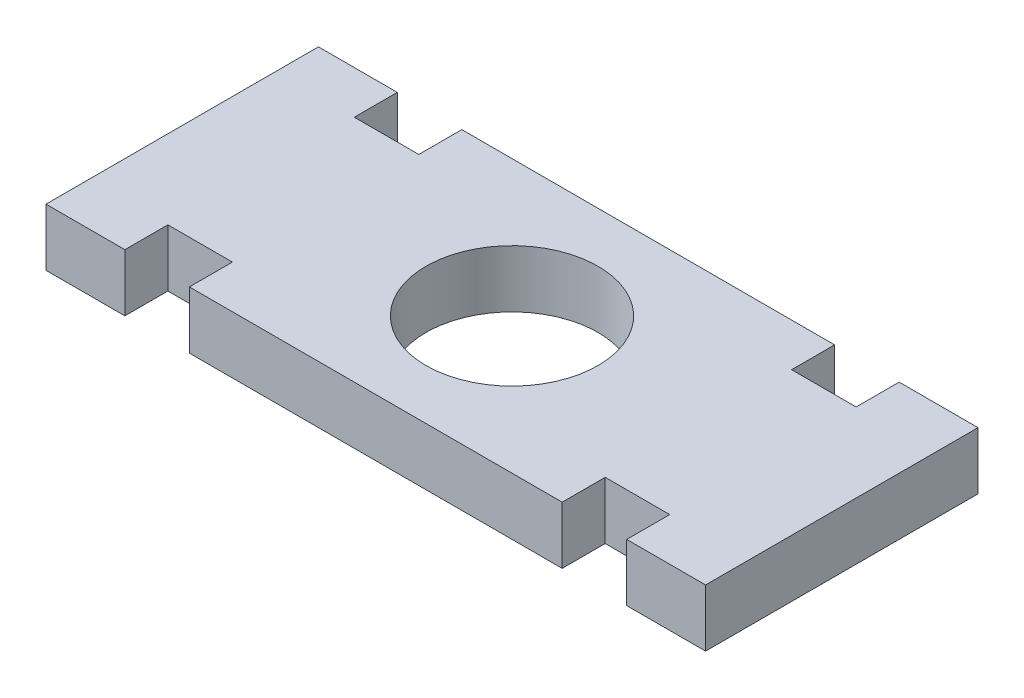
ISO-10303-21;
HEADER;
FILE_DESCRIPTION(('STEP AP214'),'2;1');
FILE_NAME('part.step','',(''),(''),'','','');
FILE_SCHEMA(('AUTOMOTIVE_DESIGN { 1 0 10303 214 1 1 1 1 }'));
ENDSEC;
DATA;
#1=APPLICATION_CONTEXT('core data for automotive mechanical design processes');
#2=APPLICATION_PROTOCOL_DEFINITION('international standard','automotive_design',2000,#1);
#3=PRODUCT_CONTEXT('',#1,'mechanical');
#4=PRODUCT('Part','Part','',(#3));
#5=PRODUCT_RELATED_PRODUCT_CATEGORY('part','',(#4));
#6=PRODUCT_DEFINITION_FORMATION('','',#4);
#7=PRODUCT_DEFINITION_CONTEXT('part definition',#1,'design');
#8=PRODUCT_DEFINITION('design','',#6,#7);
#9=PRODUCT_DEFINITION_SHAPE('','',#8);
#10=(LENGTH_UNIT() NAMED_UNIT(*) SI_UNIT(.MILLI.,.METRE.));
#11=(NAMED_UNIT(*) PLANE_ANGLE_UNIT() SI_UNIT($,.RADIAN.));
#12=(NAMED_UNIT(*) SI_UNIT($,.STERADIAN.) SOLID_ANGLE_UNIT());
#13=UNCERTAINTY_MEASURE_WITH_UNIT(LENGTH_MEASURE(1.E-05),#10,'distance_accuracy_value','');
#14=(GEOMETRIC_REPRESENTATION_CONTEXT(3) GLOBAL_UNCERTAINTY_ASSIGNED_CONTEXT((#13)) GLOBAL_UNIT_ASSIGNED_CONTEXT((#10,
#11,#12)) REPRESENTATION_CONTEXT('',''));
#15=CARTESIAN_POINT('',(0.,0.,0.));
#16=DIRECTION('',(0.,0.,1.));
#17=DIRECTION('',(1.,0.,0.));
#18=AXIS2_PLACEMENT_3D('',#15,#16,#17);
#19=CARTESIAN_POINT('',(0.,4.,-19.));
#20=DIRECTION('',(0.,1.,0.));
#21=DIRECTION('',(0.,0.,1.));
#22=AXIS2_PLACEMENT_3D('',#19,#20,#21);
#23=PLANE('',#22);
#24=DIRECTION('',(0.,0.,-1.));
#25=VECTOR('',#24,1.);
#26=CARTESIAN_POINT('',(0.,4.,0.));
#27=LINE('',#26,#25);
#28=CARTESIAN_POINT('',(0.,4.,0.));
#29=VERTEX_POINT('',#28);
#30=CARTESIAN_POINT('',(0.,4.,-19.));
#31=VERTEX_POINT('',#30);
#32=EDGE_CURVE('E241',#29,#31,#27,.T.);
#33=ORIENTED_EDGE('',*,*,#32,.T.);
#34=DIRECTION('',(-1.,0.,0.));
#35=VECTOR('',#34,1.);
#36=CARTESIAN_POINT('',(0.,4.,-19.));
#37=LINE('',#36,#35);
#38=CARTESIAN_POINT('',(-5.50000000000002,4.,-19.));
#39=VERTEX_POINT('',#38);
#40=EDGE_CURVE('E129',#31,#39,#37,.T.);
#41=ORIENTED_EDGE('',*,*,#40,.T.);
#42=DIRECTION('',(0.,0.,1.));
#43=VECTOR('',#42,1.);
#44=CARTESIAN_POINT('',(-5.50000000000002,4.,-19.));
#45=LINE('',#44,#43);
#46=CARTESIAN_POINT('',(-5.50000000000002,4.,-16.));
#47=VERTEX_POINT('',#46);
#48=EDGE_CURVE('E292',#39,#47,#45,.T.);
#49=ORIENTED_EDGE('',*,*,#48,.T.);
#50=DIRECTION('',(-1.,0.,0.));
#51=VECTOR('',#50,1.);
#52=CARTESIAN_POINT('',(-5.50000000000002,4.,-16.));
#53=LINE('',#52,#51);
#54=CARTESIAN_POINT('',(-10.,4.,-16.));
#55=VERTEX_POINT('',#54);
#56=EDGE_CURVE('E311',#47,#55,#53,.T.);
#57=ORIENTED_EDGE('',*,*,#56,.T.);
#58=DIRECTION('',(0.,0.,-1.));
#59=VECTOR('',#58,1.);
#60=CARTESIAN_POINT('',(-10.,4.,-19.));
#61=LINE('',#60,#59);
#62=CARTESIAN_POINT('',(-10.,4.,-19.));
#63=VERTEX_POINT('',#62);
#64=EDGE_CURVE('E308',#55,#63,#61,.T.);
#65=ORIENTED_EDGE('',*,*,#64,.T.);
#66=DIRECTION('',(-1.,0.,0.));
#67=VECTOR('',#66,1.);
#68=CARTESIAN_POINT('',(-10.,4.,-19.));
#69=LINE('',#68,#67);
#70=CARTESIAN_POINT('',(-36.,4.,-19.));
#71=VERTEX_POINT('',#70);
#72=EDGE_CURVE('E310',#63,#71,#69,.T.);
#73=ORIENTED_EDGE('',*,*,#72,.T.);
#74=DIRECTION('',(0.,0.,1.));
#75=VECTOR('',#74,1.);
#76=CARTESIAN_POINT('',(-36.,4.,-19.));
#77=LINE('',#76,#75);
#78=CARTESIAN_POINT('',(-36.,4.,-16.));
#79=VERTEX_POINT('',#78);
#80=EDGE_CURVE('E313',#71,#79,#77,.T.);
#81=ORIENTED_EDGE('',*,*,#80,.T.);
#82=DIRECTION('',(-1.,0.,0.));
#83=VECTOR('',#82,1.);
#84=CARTESIAN_POINT('',(-40.5,4.,-16.));
#85=LINE('',#84,#83);
#86=CARTESIAN_POINT('',(-40.5,4.,-16.));
#87=VERTEX_POINT('',#86);
#88=EDGE_CURVE('E319',#79,#87,#85,.T.);
#89=ORIENTED_EDGE('',*,*,#88,.T.);
#90=DIRECTION('',(0.,0.,-1.));
#91=VECTOR('',#90,1.);
#92=CARTESIAN_POINT('',(-40.5,4.,-19.));
#93=LINE('',#92,#91);
#94=CARTESIAN_POINT('',(-40.5,4.,-19.));
#95=VERTEX_POINT('',#94);
#96=EDGE_CURVE('E321',#87,#95,#93,.T.);
#97=ORIENTED_EDGE('',*,*,#96,.T.);
#98=DIRECTION('',(-1.,0.,0.));
#99=VECTOR('',#98,1.);
#100=CARTESIAN_POINT('',(-40.5,4.,-19.));
#101=LINE('',#100,#99);
#102=CARTESIAN_POINT('',(-46.,4.,-19.));
#103=VERTEX_POINT('',#102);
#104=EDGE_CURVE('E323',#95,#103,#101,.T.);
#105=ORIENTED_EDGE('',*,*,#104,.T.);
#106=DIRECTION('',(0.,0.,1.));
#107=VECTOR('',#106,1.);
#108=CARTESIAN_POINT('',(-46.,4.,0.));
#109=LINE('',#108,#107);
#110=CARTESIAN_POINT('',(-46.,4.,0.));
#111=VERTEX_POINT('',#110);
#112=EDGE_CURVE('E325',#103,#111,#109,.T.);
#113=ORIENTED_EDGE('',*,*,#112,.T.);
#114=DIRECTION('',(1.,0.,0.));
#115=VECTOR('',#114,1.);
#116=CARTESIAN_POINT('',(-40.5,4.,0.));
#117=LINE('',#116,#115);
#118=CARTESIAN_POINT('',(-40.5,4.,0.));
#119=VERTEX_POINT('',#118);
#120=EDGE_CURVE('E327',#111,#119,#117,.T.);
#121=ORIENTED_EDGE('',*,*,#120,.T.);
#122=DIRECTION('',(0.,0.,-1.));
#123=VECTOR('',#122,1.);
#124=CARTESIAN_POINT('',(-40.5,4.,0.));
#125=LINE('',#124,#123);
#126=CARTESIAN_POINT('',(-40.5,4.,-2.99999999999999));
#127=VERTEX_POINT('',#126);
#128=EDGE_CURVE('E329',#119,#127,#125,.T.);
#129=ORIENTED_EDGE('',*,*,#128,.T.);
#130=DIRECTION('',(1.,0.,0.));
#131=VECTOR('',#130,1.);
#132=CARTESIAN_POINT('',(-40.5,4.,-2.99999999999999));
#133=LINE('',#132,#131);
#134=CARTESIAN_POINT('',(-36.,4.,-2.99999999999999));
#135=VERTEX_POINT('',#134);
#136=EDGE_CURVE('E331',#127,#135,#133,.T.);
#137=ORIENTED_EDGE('',*,*,#136,.T.);
#138=DIRECTION('',(0.,0.,1.));
#139=VECTOR('',#138,1.);
#140=CARTESIAN_POINT('',(-36.,4.,0.));
#141=LINE('',#140,#139);
#142=CARTESIAN_POINT('',(-36.,4.,0.));
#143=VERTEX_POINT('',#142);
#144=EDGE_CURVE('E333',#135,#143,#141,.T.);
#145=ORIENTED_EDGE('',*,*,#144,.T.);
#146=DIRECTION('',(1.,0.,0.));
#147=VECTOR('',#146,1.);
#148=CARTESIAN_POINT('',(-10.,4.,0.));
#149=LINE('',#148,#147);
#150=CARTESIAN_POINT('',(-10.,4.,0.));
#151=VERTEX_POINT('',#150);
#152=EDGE_CURVE('E335',#143,#151,#149,.T.);
#153=ORIENTED_EDGE('',*,*,#152,.T.);
#154=DIRECTION('',(0.,0.,-1.));
#155=VECTOR('',#154,1.);
#156=CARTESIAN_POINT('',(-10.,4.,0.));
#157=LINE('',#156,#155);
#158=CARTESIAN_POINT('',(-10.,4.,-2.99999999999999));
#159=VERTEX_POINT('',#158);
#160=EDGE_CURVE('E184',#151,#159,#157,.T.);
#161=ORIENTED_EDGE('',*,*,#160,.T.);
#162=DIRECTION('',(1.,0.,0.));
#163=VECTOR('',#162,1.);
#164=CARTESIAN_POINT('',(-5.50000000000002,4.,-2.99999999999999));
#165=LINE('',#164,#163);
#166=CARTESIAN_POINT('',(-5.50000000000002,4.,-2.99999999999999));
#167=VERTEX_POINT('',#166);
#168=EDGE_CURVE('E178',#159,#167,#165,.T.);
#169=ORIENTED_EDGE('',*,*,#168,.T.);
#170=DIRECTION('',(0.,0.,1.));
#171=VECTOR('',#170,1.);
#172=CARTESIAN_POINT('',(-5.50000000000002,4.,0.));
#173=LINE('',#172,#171);
#174=CARTESIAN_POINT('',(-5.50000000000002,4.,0.));
#175=VERTEX_POINT('',#174);
#176=EDGE_CURVE('E182',#167,#175,#173,.T.);
#177=ORIENTED_EDGE('',*,*,#176,.T.);
#178=DIRECTION('',(1.,0.,0.));
#179=VECTOR('',#178,1.);
#180=CARTESIAN_POINT('',(0.,4.,0.));
#181=LINE('',#180,#179);
#182=EDGE_CURVE('E50',#175,#29,#181,.T.);
#183=ORIENTED_EDGE('',*,*,#182,.T.);
#184=EDGE_LOOP('',(#33,#41,#49,#57,#65,#73,#81,#89,#97,#105,#113,#121,#129,#137,#145,#153,#161,
#169,#177,#183));
#185=FACE_BOUND('',#184,.T.);
#186=CARTESIAN_POINT('',(-23.,4.,-9.5));
#187=DIRECTION('',(0.,1.,0.));
#188=DIRECTION('',(0.,0.,1.));
#189=AXIS2_PLACEMENT_3D('',#186,#187,#188);
#190=CIRCLE('',#189,6.);
#191=CARTESIAN_POINT('',(-23.,4.,-3.5));
#192=VERTEX_POINT('',#191);
#193=EDGE_CURVE('E206',#192,#192,#190,.T.);
#194=ORIENTED_EDGE('',*,*,#193,.F.);
#195=EDGE_LOOP('',(#194));
#196=FACE_BOUND('',#195,.T.);
#197=ADVANCED_FACE('F33',(#185,#196),#23,.T.);
#198=CARTESIAN_POINT('',(0.,0.,-19.));
#199=DIRECTION('',(0.,1.,0.));
#200=DIRECTION('',(0.,0.,1.));
#201=AXIS2_PLACEMENT_3D('',#198,#199,#200);
#202=PLANE('',#201);
#203=DIRECTION('',(0.,0.,-1.));
#204=VECTOR('',#203,1.);
#205=CARTESIAN_POINT('',(0.,0.,0.));
#206=LINE('',#205,#204);
#207=CARTESIAN_POINT('',(0.,0.,0.));
#208=VERTEX_POINT('',#207);
#209=CARTESIAN_POINT('',(0.,0.,-19.));
#210=VERTEX_POINT('',#209);
#211=EDGE_CURVE('E202',#208,#210,#206,.T.);
#212=ORIENTED_EDGE('',*,*,#211,.F.);
#213=DIRECTION('',(1.,0.,0.));
#214=VECTOR('',#213,1.);
#215=CARTESIAN_POINT('',(0.,0.,0.));
#216=LINE('',#215,#214);
#217=CARTESIAN_POINT('',(-5.50000000000002,0.,0.));
#218=VERTEX_POINT('',#217);
#219=EDGE_CURVE('E121',#218,#208,#216,.T.);
#220=ORIENTED_EDGE('',*,*,#219,.F.);
#221=DIRECTION('',(0.,0.,1.));
#222=VECTOR('',#221,1.);
#223=CARTESIAN_POINT('',(-5.50000000000002,0.,0.));
#224=LINE('',#223,#222);
#225=CARTESIAN_POINT('',(-5.50000000000002,0.,-2.99999999999999));
#226=VERTEX_POINT('',#225);
#227=EDGE_CURVE('E115',#226,#218,#224,.T.);
#228=ORIENTED_EDGE('',*,*,#227,.F.);
#229=DIRECTION('',(1.,0.,0.));
#230=VECTOR('',#229,1.);
#231=CARTESIAN_POINT('',(-5.50000000000002,0.,-2.99999999999999));
#232=LINE('',#231,#230);
#233=CARTESIAN_POINT('',(-10.,0.,-2.99999999999999));
#234=VERTEX_POINT('',#233);
#235=EDGE_CURVE('E192',#234,#226,#232,.T.);
#236=ORIENTED_EDGE('',*,*,#235,.F.);
#237=DIRECTION('',(0.,0.,-1.));
#238=VECTOR('',#237,1.);
#239=CARTESIAN_POINT('',(-10.,0.,0.));
#240=LINE('',#239,#238);
#241=CARTESIAN_POINT('',(-10.,0.,0.));
#242=VERTEX_POINT('',#241);
#243=EDGE_CURVE('E236',#242,#234,#240,.T.);
#244=ORIENTED_EDGE('',*,*,#243,.F.);
#245=DIRECTION('',(1.,0.,0.));
#246=VECTOR('',#245,1.);
#247=CARTESIAN_POINT('',(-10.,0.,0.));
#248=LINE('',#247,#246);
#249=CARTESIAN_POINT('',(-36.,0.,0.));
#250=VERTEX_POINT('',#249);
#251=EDGE_CURVE('E234',#250,#242,#248,.T.);
#252=ORIENTED_EDGE('',*,*,#251,.F.);
#253=DIRECTION('',(0.,0.,1.));
#254=VECTOR('',#253,1.);
#255=CARTESIAN_POINT('',(-36.,0.,0.));
#256=LINE('',#255,#254);
#257=CARTESIAN_POINT('',(-36.,0.,-2.99999999999999));
#258=VERTEX_POINT('',#257);
#259=EDGE_CURVE('E232',#258,#250,#256,.T.);
#260=ORIENTED_EDGE('',*,*,#259,.F.);
#261=DIRECTION('',(1.,0.,0.));
#262=VECTOR('',#261,1.);
#263=CARTESIAN_POINT('',(-40.5,0.,-2.99999999999999));
#264=LINE('',#263,#262);
#265=CARTESIAN_POINT('',(-40.5,0.,-2.99999999999999));
#266=VERTEX_POINT('',#265);
#267=EDGE_CURVE('E230',#266,#258,#264,.T.);
#268=ORIENTED_EDGE('',*,*,#267,.F.);
#269=DIRECTION('',(0.,0.,-1.));
#270=VECTOR('',#269,1.);
#271=CARTESIAN_POINT('',(-40.5,0.,0.));
#272=LINE('',#271,#270);
#273=CARTESIAN_POINT('',(-40.5,0.,0.));
#274=VERTEX_POINT('',#273);
#275=EDGE_CURVE('E228',#274,#266,#272,.T.);
#276=ORIENTED_EDGE('',*,*,#275,.F.);
#277=DIRECTION('',(1.,0.,0.));
#278=VECTOR('',#277,1.);
#279=CARTESIAN_POINT('',(-40.5,0.,0.));
#280=LINE('',#279,#278);
#281=CARTESIAN_POINT('',(-46.,0.,0.));
#282=VERTEX_POINT('',#281);
#283=EDGE_CURVE('E226',#282,#274,#280,.T.);
#284=ORIENTED_EDGE('',*,*,#283,.F.);
#285=DIRECTION('',(0.,0.,1.));
#286=VECTOR('',#285,1.);
#287=CARTESIAN_POINT('',(-46.,0.,0.));
#288=LINE('',#287,#286);
#289=CARTESIAN_POINT('',(-46.,0.,-19.));
#290=VERTEX_POINT('',#289);
#291=EDGE_CURVE('E224',#290,#282,#288,.T.);
#292=ORIENTED_EDGE('',*,*,#291,.F.);
#293=DIRECTION('',(-1.,0.,0.));
#294=VECTOR('',#293,1.);
#295=CARTESIAN_POINT('',(-40.5,0.,-19.));
#296=LINE('',#295,#294);
#297=CARTESIAN_POINT('',(-40.5,0.,-19.));
#298=VERTEX_POINT('',#297);
#299=EDGE_CURVE('E222',#298,#290,#296,.T.);
#300=ORIENTED_EDGE('',*,*,#299,.F.);
#301=DIRECTION('',(0.,0.,-1.));
#302=VECTOR('',#301,1.);
#303=CARTESIAN_POINT('',(-40.5,0.,-19.));
#304=LINE('',#303,#302);
#305=CARTESIAN_POINT('',(-40.5,0.,-16.));
#306=VERTEX_POINT('',#305);
#307=EDGE_CURVE('E220',#306,#298,#304,.T.);
#308=ORIENTED_EDGE('',*,*,#307,.F.);
#309=DIRECTION('',(-1.,0.,0.));
#310=VECTOR('',#309,1.);
#311=CARTESIAN_POINT('',(-40.5,0.,-16.));
#312=LINE('',#311,#310);
#313=CARTESIAN_POINT('',(-36.,0.,-16.));
#314=VERTEX_POINT('',#313);
#315=EDGE_CURVE('E218',#314,#306,#312,.T.);
#316=ORIENTED_EDGE('',*,*,#315,.F.);
#317=DIRECTION('',(0.,0.,1.));
#318=VECTOR('',#317,1.);
#319=CARTESIAN_POINT('',(-36.,0.,-19.));
#320=LINE('',#319,#318);
#321=CARTESIAN_POINT('',(-36.,0.,-19.));
#322=VERTEX_POINT('',#321);
#323=EDGE_CURVE('E216',#322,#314,#320,.T.);
#324=ORIENTED_EDGE('',*,*,#323,.F.);
#325=DIRECTION('',(-1.,0.,0.));
#326=VECTOR('',#325,1.);
#327=CARTESIAN_POINT('',(-10.,0.,-19.));
#328=LINE('',#327,#326);
#329=CARTESIAN_POINT('',(-10.,0.,-19.));
#330=VERTEX_POINT('',#329);
#331=EDGE_CURVE('E214',#330,#322,#328,.T.);
#332=ORIENTED_EDGE('',*,*,#331,.F.);
#333=DIRECTION('',(0.,0.,-1.));
#334=VECTOR('',#333,1.);
#335=CARTESIAN_POINT('',(-10.,0.,-19.));
#336=LINE('',#335,#334);
#337=CARTESIAN_POINT('',(-10.,0.,-16.));
#338=VERTEX_POINT('',#337);
#339=EDGE_CURVE('E212',#338,#330,#336,.T.);
#340=ORIENTED_EDGE('',*,*,#339,.F.);
#341=DIRECTION('',(-1.,0.,0.));
#342=VECTOR('',#341,1.);
#343=CARTESIAN_POINT('',(-5.50000000000002,0.,-16.));
#344=LINE('',#343,#342);
#345=CARTESIAN_POINT('',(-5.50000000000002,0.,-16.));
#346=VERTEX_POINT('',#345);
#347=EDGE_CURVE('E210',#346,#338,#344,.T.);
#348=ORIENTED_EDGE('',*,*,#347,.F.);
#349=DIRECTION('',(0.,0.,1.));
#350=VECTOR('',#349,1.);
#351=CARTESIAN_POINT('',(-5.50000000000002,0.,-19.));
#352=LINE('',#351,#350);
#353=CARTESIAN_POINT('',(-5.50000000000002,0.,-19.));
#354=VERTEX_POINT('',#353);
#355=EDGE_CURVE('E208',#354,#346,#352,.T.);
#356=ORIENTED_EDGE('',*,*,#355,.F.);
#357=DIRECTION('',(-1.,0.,0.));
#358=VECTOR('',#357,1.);
#359=CARTESIAN_POINT('',(0.,0.,-19.));
#360=LINE('',#359,#358);
#361=EDGE_CURVE('E205',#210,#354,#360,.T.);
#362=ORIENTED_EDGE('',*,*,#361,.F.);
#363=EDGE_LOOP('',(#212,#220,#228,#236,#244,#252,#260,#268,#276,#284,#292,#300,#308,#316,#324,
#332,#340,#348,#356,#362));
#364=FACE_BOUND('',#363,.T.);
#365=CARTESIAN_POINT('',(-23.,0.,-9.5));
#366=DIRECTION('',(0.,1.,0.));
#367=DIRECTION('',(0.,0.,1.));
#368=AXIS2_PLACEMENT_3D('',#365,#366,#367);
#369=CIRCLE('',#368,6.);
#370=CARTESIAN_POINT('',(-23.,0.,-3.5));
#371=VERTEX_POINT('',#370);
#372=EDGE_CURVE('E586',#371,#371,#369,.T.);
#373=ORIENTED_EDGE('',*,*,#372,.T.);
#374=EDGE_LOOP('',(#373));
#375=FACE_BOUND('',#374,.T.);
#376=ADVANCED_FACE('F296',(#364,#375),#202,.F.);
#377=CARTESIAN_POINT('',(0.,4.,0.));
#378=DIRECTION('',(-1.,0.,0.));
#379=DIRECTION('',(0.,0.,1.));
#380=AXIS2_PLACEMENT_3D('',#377,#378,#379);
#381=PLANE('',#380);
#382=ORIENTED_EDGE('',*,*,#211,.T.);
#383=DIRECTION('',(0.,-1.,0.));
#384=VECTOR('',#383,1.);
#385=CARTESIAN_POINT('',(0.,4.,-19.));
#386=LINE('',#385,#384);
#387=EDGE_CURVE('E11',#31,#210,#386,.T.);
#388=ORIENTED_EDGE('',*,*,#387,.F.);
#389=ORIENTED_EDGE('',*,*,#32,.F.);
#390=DIRECTION('',(0.,-1.,0.));
#391=VECTOR('',#390,1.);
#392=CARTESIAN_POINT('',(0.,4.,0.));
#393=LINE('',#392,#391);
#394=EDGE_CURVE('E198',#29,#208,#393,.T.);
#395=ORIENTED_EDGE('',*,*,#394,.T.);
#396=EDGE_LOOP('',(#382,#388,#389,#395));
#397=FACE_BOUND('',#396,.T.);
#398=ADVANCED_FACE('F35',(#397),#381,.F.);
#399=CARTESIAN_POINT('',(0.,4.,-19.));
#400=DIRECTION('',(0.,0.,1.));
#401=DIRECTION('',(1.,0.,0.));
#402=AXIS2_PLACEMENT_3D('',#399,#400,#401);
#403=PLANE('',#402);
#404=ORIENTED_EDGE('',*,*,#361,.T.);
#405=DIRECTION('',(0.,-1.,0.));
#406=VECTOR('',#405,1.);
#407=CARTESIAN_POINT('',(-5.50000000000002,4.,-19.));
#408=LINE('',#407,#406);
#409=EDGE_CURVE('E42',#39,#354,#408,.T.);
#410=ORIENTED_EDGE('',*,*,#409,.F.);
#411=ORIENTED_EDGE('',*,*,#40,.F.);
#412=ORIENTED_EDGE('',*,*,#387,.T.);
#413=EDGE_LOOP('',(#404,#410,#411,#412));
#414=FACE_BOUND('',#413,.T.);
#415=ADVANCED_FACE('F369',(#414),#403,.F.);
#416=CARTESIAN_POINT('',(-5.50000000000002,4.,-19.));
#417=DIRECTION('',(1.,0.,0.));
#418=DIRECTION('',(0.,0.,-1.));
#419=AXIS2_PLACEMENT_3D('',#416,#417,#418);
#420=PLANE('',#419);
#421=ORIENTED_EDGE('',*,*,#355,.T.);
#422=DIRECTION('',(0.,-1.,0.));
#423=VECTOR('',#422,1.);
#424=CARTESIAN_POINT('',(-5.50000000000002,4.,-16.));
#425=LINE('',#424,#423);
#426=EDGE_CURVE('E284',#47,#346,#425,.T.);
#427=ORIENTED_EDGE('',*,*,#426,.F.);
#428=ORIENTED_EDGE('',*,*,#48,.F.);
#429=ORIENTED_EDGE('',*,*,#409,.T.);
#430=EDGE_LOOP('',(#421,#427,#428,#429));
#431=FACE_BOUND('',#430,.T.);
#432=ADVANCED_FACE('F290',(#431),#420,.F.);
#433=CARTESIAN_POINT('',(-5.50000000000002,4.,-16.));
#434=DIRECTION('',(0.,0.,1.));
#435=DIRECTION('',(1.,0.,0.));
#436=AXIS2_PLACEMENT_3D('',#433,#434,#435);
#437=PLANE('',#436);
#438=ORIENTED_EDGE('',*,*,#347,.T.);
#439=DIRECTION('',(0.,-1.,0.));
#440=VECTOR('',#439,1.);
#441=CARTESIAN_POINT('',(-10.,4.,-16.));
#442=LINE('',#441,#440);
#443=EDGE_CURVE('E281',#55,#338,#442,.T.);
#444=ORIENTED_EDGE('',*,*,#443,.F.);
#445=ORIENTED_EDGE('',*,*,#56,.F.);
#446=ORIENTED_EDGE('',*,*,#426,.T.);
#447=EDGE_LOOP('',(#438,#444,#445,#446));
#448=FACE_BOUND('',#447,.T.);
#449=ADVANCED_FACE('F302',(#448),#437,.F.);
#450=CARTESIAN_POINT('',(-10.,4.,-19.));
#451=DIRECTION('',(-1.,0.,0.));
#452=DIRECTION('',(0.,0.,1.));
#453=AXIS2_PLACEMENT_3D('',#450,#451,#452);
#454=PLANE('',#453);
#455=ORIENTED_EDGE('',*,*,#339,.T.);
#456=DIRECTION('',(0.,-1.,0.));
#457=VECTOR('',#456,1.);
#458=CARTESIAN_POINT('',(-10.,4.,-19.));
#459=LINE('',#458,#457);
#460=EDGE_CURVE('E278',#63,#330,#459,.T.);
#461=ORIENTED_EDGE('',*,*,#460,.F.);
#462=ORIENTED_EDGE('',*,*,#64,.F.);
#463=ORIENTED_EDGE('',*,*,#443,.T.);
#464=EDGE_LOOP('',(#455,#461,#462,#463));
#465=FACE_BOUND('',#464,.T.);
#466=ADVANCED_FACE('F306',(#465),#454,.F.);
#467=CARTESIAN_POINT('',(-10.,4.,-19.));
#468=DIRECTION('',(0.,0.,1.));
#469=DIRECTION('',(1.,0.,0.));
#470=AXIS2_PLACEMENT_3D('',#467,#468,#469);
#471=PLANE('',#470);
#472=ORIENTED_EDGE('',*,*,#331,.T.);
#473=DIRECTION('',(0.,-1.,0.));
#474=VECTOR('',#473,1.);
#475=CARTESIAN_POINT('',(-36.,4.,-19.));
#476=LINE('',#475,#474);
#477=EDGE_CURVE('E275',#71,#322,#476,.T.);
#478=ORIENTED_EDGE('',*,*,#477,.F.);
#479=ORIENTED_EDGE('',*,*,#72,.F.);
#480=ORIENTED_EDGE('',*,*,#460,.T.);
#481=EDGE_LOOP('',(#472,#478,#479,#480));
#482=FACE_BOUND('',#481,.T.);
#483=ADVANCED_FACE('F382',(#482),#471,.F.);
#484=CARTESIAN_POINT('',(-36.,4.,-19.));
#485=DIRECTION('',(1.,0.,0.));
#486=DIRECTION('',(0.,0.,-1.));
#487=AXIS2_PLACEMENT_3D('',#484,#485,#486);
#488=PLANE('',#487);
#489=ORIENTED_EDGE('',*,*,#323,.T.);
#490=DIRECTION('',(0.,-1.,0.));
#491=VECTOR('',#490,1.);
#492=CARTESIAN_POINT('',(-36.,4.,-16.));
#493=LINE('',#492,#491);
#494=EDGE_CURVE('E272',#79,#314,#493,.T.);
#495=ORIENTED_EDGE('',*,*,#494,.F.);
#496=ORIENTED_EDGE('',*,*,#80,.F.);
#497=ORIENTED_EDGE('',*,*,#477,.T.);
#498=EDGE_LOOP('',(#489,#495,#496,#497));
#499=FACE_BOUND('',#498,.T.);
#500=ADVANCED_FACE('F385',(#499),#488,.F.);
#501=CARTESIAN_POINT('',(-40.5,4.,-16.));
#502=DIRECTION('',(0.,0.,1.));
#503=DIRECTION('',(1.,0.,0.));
#504=AXIS2_PLACEMENT_3D('',#501,#502,#503);
#505=PLANE('',#504);
#506=ORIENTED_EDGE('',*,*,#315,.T.);
#507=DIRECTION('',(0.,-1.,0.));
#508=VECTOR('',#507,1.);
#509=CARTESIAN_POINT('',(-40.5,4.,-16.));
#510=LINE('',#509,#508);
#511=EDGE_CURVE('E269',#87,#306,#510,.T.);
#512=ORIENTED_EDGE('',*,*,#511,.F.);
#513=ORIENTED_EDGE('',*,*,#88,.F.);
#514=ORIENTED_EDGE('',*,*,#494,.T.);
#515=EDGE_LOOP('',(#506,#512,#513,#514));
#516=FACE_BOUND('',#515,.T.);
#517=ADVANCED_FACE('F389',(#516),#505,.F.);
#518=CARTESIAN_POINT('',(-40.5,4.,-19.));
#519=DIRECTION('',(-1.,0.,0.));
#520=DIRECTION('',(0.,0.,1.));
#521=AXIS2_PLACEMENT_3D('',#518,#519,#520);
#522=PLANE('',#521);
#523=ORIENTED_EDGE('',*,*,#307,.T.);
#524=DIRECTION('',(0.,-1.,0.));
#525=VECTOR('',#524,1.);
#526=CARTESIAN_POINT('',(-40.5,4.,-19.));
#527=LINE('',#526,#525);
#528=EDGE_CURVE('E266',#95,#298,#527,.T.);
#529=ORIENTED_EDGE('',*,*,#528,.F.);
#530=ORIENTED_EDGE('',*,*,#96,.F.);
#531=ORIENTED_EDGE('',*,*,#511,.T.);
#532=EDGE_LOOP('',(#523,#529,#530,#531));
#533=FACE_BOUND('',#532,.T.);
#534=ADVANCED_FACE('F393',(#533),#522,.F.);
#535=CARTESIAN_POINT('',(-40.5,4.,-19.));
#536=DIRECTION('',(0.,0.,1.));
#537=DIRECTION('',(1.,0.,0.));
#538=AXIS2_PLACEMENT_3D('',#535,#536,#537);
#539=PLANE('',#538);
#540=ORIENTED_EDGE('',*,*,#299,.T.);
#541=DIRECTION('',(0.,-1.,0.));
#542=VECTOR('',#541,1.);
#543=CARTESIAN_POINT('',(-46.,4.,-19.));
#544=LINE('',#543,#542);
#545=EDGE_CURVE('E263',#103,#290,#544,.T.);
#546=ORIENTED_EDGE('',*,*,#545,.F.);
#547=ORIENTED_EDGE('',*,*,#104,.F.);
#548=ORIENTED_EDGE('',*,*,#528,.T.);
#549=EDGE_LOOP('',(#540,#546,#547,#548));
#550=FACE_BOUND('',#549,.T.);
#551=ADVANCED_FACE('F397',(#550),#539,.F.);
#552=CARTESIAN_POINT('',(-46.,4.,0.));
#553=DIRECTION('',(1.,0.,0.));
#554=DIRECTION('',(0.,0.,-1.));
#555=AXIS2_PLACEMENT_3D('',#552,#553,#554);
#556=PLANE('',#555);
#557=ORIENTED_EDGE('',*,*,#291,.T.);
#558=DIRECTION('',(0.,-1.,0.));
#559=VECTOR('',#558,1.);
#560=CARTESIAN_POINT('',(-46.,4.,0.));
#561=LINE('',#560,#559);
#562=EDGE_CURVE('E260',#111,#282,#561,.T.);
#563=ORIENTED_EDGE('',*,*,#562,.F.);
#564=ORIENTED_EDGE('',*,*,#112,.F.);
#565=ORIENTED_EDGE('',*,*,#545,.T.);
#566=EDGE_LOOP('',(#557,#563,#564,#565));
#567=FACE_BOUND('',#566,.T.);
#568=ADVANCED_FACE('F401',(#567),#556,.F.);
#569=CARTESIAN_POINT('',(-40.5,4.,0.));
#570=DIRECTION('',(0.,0.,-1.));
#571=DIRECTION('',(-1.,0.,0.));
#572=AXIS2_PLACEMENT_3D('',#569,#570,#571);
#573=PLANE('',#572);
#574=ORIENTED_EDGE('',*,*,#283,.T.);
#575=DIRECTION('',(0.,-1.,0.));
#576=VECTOR('',#575,1.);
#577=CARTESIAN_POINT('',(-40.5,4.,0.));
#578=LINE('',#577,#576);
#579=EDGE_CURVE('E257',#119,#274,#578,.T.);
#580=ORIENTED_EDGE('',*,*,#579,.F.);
#581=ORIENTED_EDGE('',*,*,#120,.F.);
#582=ORIENTED_EDGE('',*,*,#562,.T.);
#583=EDGE_LOOP('',(#574,#580,#581,#582));
#584=FACE_BOUND('',#583,.T.);
#585=ADVANCED_FACE('F405',(#584),#573,.F.);
#586=CARTESIAN_POINT('',(-40.5,4.,0.));
#587=DIRECTION('',(-1.,0.,0.));
#588=DIRECTION('',(0.,0.,1.));
#589=AXIS2_PLACEMENT_3D('',#586,#587,#588);
#590=PLANE('',#589);
#591=ORIENTED_EDGE('',*,*,#275,.T.);
#592=DIRECTION('',(0.,-1.,0.));
#593=VECTOR('',#592,1.);
#594=CARTESIAN_POINT('',(-40.5,4.,-2.99999999999999));
#595=LINE('',#594,#593);
#596=EDGE_CURVE('E254',#127,#266,#595,.T.);
#597=ORIENTED_EDGE('',*,*,#596,.F.);
#598=ORIENTED_EDGE('',*,*,#128,.F.);
#599=ORIENTED_EDGE('',*,*,#579,.T.);
#600=EDGE_LOOP('',(#591,#597,#598,#599));
#601=FACE_BOUND('',#600,.T.);
#602=ADVANCED_FACE('F409',(#601),#590,.F.);
#603=CARTESIAN_POINT('',(-40.5,4.,-2.99999999999999));
#604=DIRECTION('',(0.,0.,-1.));
#605=DIRECTION('',(-1.,0.,0.));
#606=AXIS2_PLACEMENT_3D('',#603,#604,#605);
#607=PLANE('',#606);
#608=ORIENTED_EDGE('',*,*,#267,.T.);
#609=DIRECTION('',(0.,-1.,0.));
#610=VECTOR('',#609,1.);
#611=CARTESIAN_POINT('',(-36.,4.,-2.99999999999999));
#612=LINE('',#611,#610);
#613=EDGE_CURVE('E251',#135,#258,#612,.T.);
#614=ORIENTED_EDGE('',*,*,#613,.F.);
#615=ORIENTED_EDGE('',*,*,#136,.F.);
#616=ORIENTED_EDGE('',*,*,#596,.T.);
#617=EDGE_LOOP('',(#608,#614,#615,#616));
#618=FACE_BOUND('',#617,.T.);
#619=ADVANCED_FACE('F413',(#618),#607,.F.);
#620=CARTESIAN_POINT('',(-36.,4.,0.));
#621=DIRECTION('',(1.,0.,0.));
#622=DIRECTION('',(0.,0.,-1.));
#623=AXIS2_PLACEMENT_3D('',#620,#621,#622);
#624=PLANE('',#623);
#625=ORIENTED_EDGE('',*,*,#259,.T.);
#626=DIRECTION('',(0.,-1.,0.));
#627=VECTOR('',#626,1.);
#628=CARTESIAN_POINT('',(-36.,4.,0.));
#629=LINE('',#628,#627);
#630=EDGE_CURVE('E248',#143,#250,#629,.T.);
#631=ORIENTED_EDGE('',*,*,#630,.F.);
#632=ORIENTED_EDGE('',*,*,#144,.F.);
#633=ORIENTED_EDGE('',*,*,#613,.T.);
#634=EDGE_LOOP('',(#625,#631,#632,#633));
#635=FACE_BOUND('',#634,.T.);
#636=ADVANCED_FACE('F417',(#635),#624,.F.);
#637=CARTESIAN_POINT('',(-10.,4.,0.));
#638=DIRECTION('',(0.,0.,-1.));
#639=DIRECTION('',(-1.,0.,0.));
#640=AXIS2_PLACEMENT_3D('',#637,#638,#639);
#641=PLANE('',#640);
#642=ORIENTED_EDGE('',*,*,#251,.T.);
#643=DIRECTION('',(0.,-1.,0.));
#644=VECTOR('',#643,1.);
#645=CARTESIAN_POINT('',(-10.,4.,0.));
#646=LINE('',#645,#644);
#647=EDGE_CURVE('E245',#151,#242,#646,.T.);
#648=ORIENTED_EDGE('',*,*,#647,.F.);
#649=ORIENTED_EDGE('',*,*,#152,.F.);
#650=ORIENTED_EDGE('',*,*,#630,.T.);
#651=EDGE_LOOP('',(#642,#648,#649,#650));
#652=FACE_BOUND('',#651,.T.);
#653=ADVANCED_FACE('F341',(#652),#641,.F.);
#654=CARTESIAN_POINT('',(-10.,4.,0.));
#655=DIRECTION('',(-1.,0.,0.));
#656=DIRECTION('',(0.,0.,1.));
#657=AXIS2_PLACEMENT_3D('',#654,#655,#656);
#658=PLANE('',#657);
#659=ORIENTED_EDGE('',*,*,#243,.T.);
#660=DIRECTION('',(0.,-1.,0.));
#661=VECTOR('',#660,1.);
#662=CARTESIAN_POINT('',(-10.,4.,-2.99999999999999));
#663=LINE('',#662,#661);
#664=EDGE_CURVE('E193',#159,#234,#663,.T.);
#665=ORIENTED_EDGE('',*,*,#664,.F.);
#666=ORIENTED_EDGE('',*,*,#160,.F.);
#667=ORIENTED_EDGE('',*,*,#647,.T.);
#668=EDGE_LOOP('',(#659,#665,#666,#667));
#669=FACE_BOUND('',#668,.T.);
#670=ADVANCED_FACE('F345',(#669),#658,.F.);
#671=CARTESIAN_POINT('',(-5.50000000000002,4.,-2.99999999999999));
#672=DIRECTION('',(0.,0.,-1.));
#673=DIRECTION('',(-1.,0.,0.));
#674=AXIS2_PLACEMENT_3D('',#671,#672,#673);
#675=PLANE('',#674);
#676=ORIENTED_EDGE('',*,*,#235,.T.);
#677=DIRECTION('',(0.,-1.,0.));
#678=VECTOR('',#677,1.);
#679=CARTESIAN_POINT('',(-5.50000000000002,4.,-2.99999999999999));
#680=LINE('',#679,#678);
#681=EDGE_CURVE('E189',#167,#226,#680,.T.);
#682=ORIENTED_EDGE('',*,*,#681,.F.);
#683=ORIENTED_EDGE('',*,*,#168,.F.);
#684=ORIENTED_EDGE('',*,*,#664,.T.);
#685=EDGE_LOOP('',(#676,#682,#683,#684));
#686=FACE_BOUND('',#685,.T.);
#687=ADVANCED_FACE('F190',(#686),#675,.F.);
#688=CARTESIAN_POINT('',(-5.50000000000002,4.,0.));
#689=DIRECTION('',(1.,0.,0.));
#690=DIRECTION('',(0.,0.,-1.));
#691=AXIS2_PLACEMENT_3D('',#688,#689,#690);
#692=PLANE('',#691);
#693=ORIENTED_EDGE('',*,*,#227,.T.);
#694=DIRECTION('',(0.,-1.,0.));
#695=VECTOR('',#694,1.);
#696=CARTESIAN_POINT('',(-5.50000000000002,4.,0.));
#697=LINE('',#696,#695);
#698=EDGE_CURVE('E194',#175,#218,#697,.T.);
#699=ORIENTED_EDGE('',*,*,#698,.F.);
#700=ORIENTED_EDGE('',*,*,#176,.F.);
#701=ORIENTED_EDGE('',*,*,#681,.T.);
#702=EDGE_LOOP('',(#693,#699,#700,#701));
#703=FACE_BOUND('',#702,.T.);
#704=ADVANCED_FACE('F196',(#703),#692,.F.);
#705=CARTESIAN_POINT('',(0.,4.,0.));
#706=DIRECTION('',(0.,0.,-1.));
#707=DIRECTION('',(-1.,0.,0.));
#708=AXIS2_PLACEMENT_3D('',#705,#706,#707);
#709=PLANE('',#708);
#710=ORIENTED_EDGE('',*,*,#219,.T.);
#711=ORIENTED_EDGE('',*,*,#394,.F.);
#712=ORIENTED_EDGE('',*,*,#182,.F.);
#713=ORIENTED_EDGE('',*,*,#698,.T.);
#714=EDGE_LOOP('',(#710,#711,#712,#713));
#715=FACE_BOUND('',#714,.T.);
#716=ADVANCED_FACE('F349',(#715),#709,.F.);
#717=CARTESIAN_POINT('',(-23.,4.,-9.5));
#718=DIRECTION('',(0.,-1.,0.));
#719=DIRECTION('',(0.,0.,-1.));
#720=AXIS2_PLACEMENT_3D('',#717,#718,#719);
#721=CYLINDRICAL_SURFACE('',#720,6.);
#722=ORIENTED_EDGE('',*,*,#193,.T.);
#723=EDGE_LOOP('',(#722));
#724=FACE_BOUND('',#723,.T.);
#725=ORIENTED_EDGE('',*,*,#372,.F.);
#726=EDGE_LOOP('',(#725));
#727=FACE_BOUND('',#726,.T.);
#728=ADVANCED_FACE('F351',(#724,#727),#721,.F.);
#729=CLOSED_SHELL('',(#197,#376,#398,#415,#432,#449,#466,#483,#500,#517,#534,#551,#568,#585,
#602,#619,#636,#653,#670,#687,#704,#716,#728));
#730=MANIFOLD_SOLID_BREP('B2',#729);
#731=ADVANCED_BREP_SHAPE_REPRESENTATION('',(#18,#730),#14);
#732=SHAPE_DEFINITION_REPRESENTATION(#9,#731);
ENDSEC;
END-ISO-10303-21;
